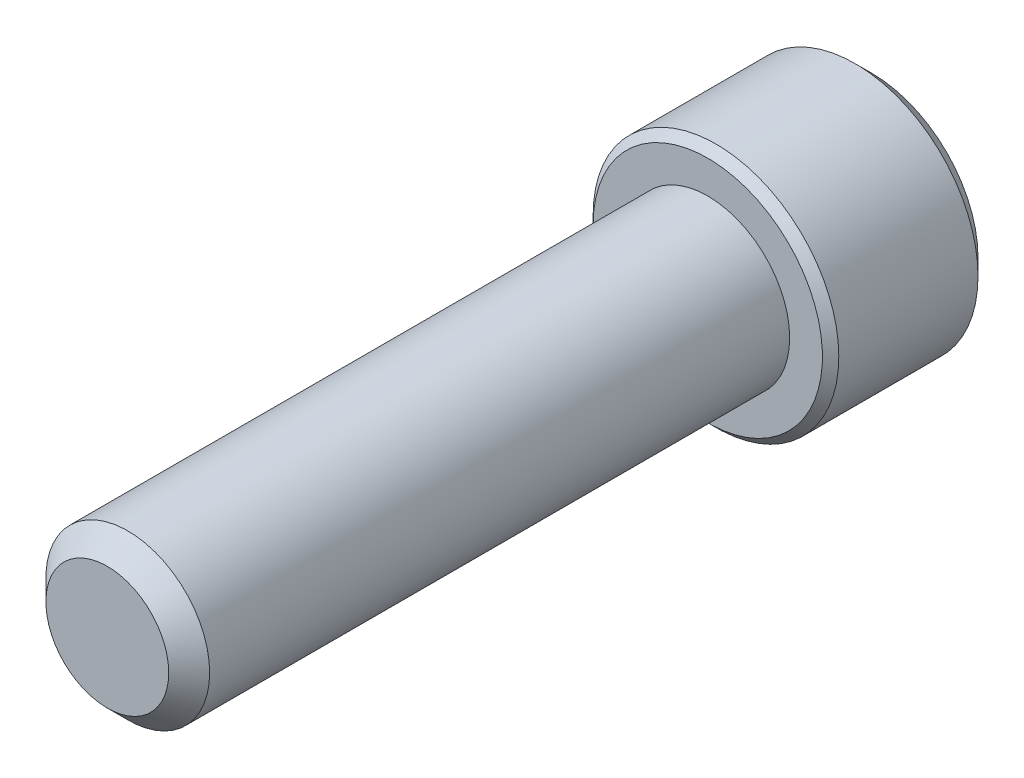
ISO-10303-21;
HEADER;
FILE_DESCRIPTION(('STEP AP214'),'2;1');
FILE_NAME('part.step','',(''),(''),'','','');
FILE_SCHEMA(('AUTOMOTIVE_DESIGN { 1 0 10303 214 1 1 1 1 }'));
ENDSEC;
DATA;
#1=APPLICATION_CONTEXT('core data for automotive mechanical design processes');
#2=APPLICATION_PROTOCOL_DEFINITION('international standard','automotive_design',2000,#1);
#3=PRODUCT_CONTEXT('',#1,'mechanical');
#4=PRODUCT('Part','Part','',(#3));
#5=PRODUCT_RELATED_PRODUCT_CATEGORY('part','',(#4));
#6=PRODUCT_DEFINITION_FORMATION('','',#4);
#7=PRODUCT_DEFINITION_CONTEXT('part definition',#1,'design');
#8=PRODUCT_DEFINITION('design','',#6,#7);
#9=PRODUCT_DEFINITION_SHAPE('','',#8);
#10=(LENGTH_UNIT() NAMED_UNIT(*) SI_UNIT(.MILLI.,.METRE.));
#11=(NAMED_UNIT(*) PLANE_ANGLE_UNIT() SI_UNIT($,.RADIAN.));
#12=(NAMED_UNIT(*) SI_UNIT($,.STERADIAN.) SOLID_ANGLE_UNIT());
#13=UNCERTAINTY_MEASURE_WITH_UNIT(LENGTH_MEASURE(1.E-05),#10,'distance_accuracy_value','');
#14=(GEOMETRIC_REPRESENTATION_CONTEXT(3) GLOBAL_UNCERTAINTY_ASSIGNED_CONTEXT((#13)) GLOBAL_UNIT_ASSIGNED_CONTEXT((#10,
#11,#12)) REPRESENTATION_CONTEXT('',''));
#15=CARTESIAN_POINT('',(0.,0.,0.));
#16=DIRECTION('',(0.,0.,1.));
#17=DIRECTION('',(1.,0.,0.));
#18=AXIS2_PLACEMENT_3D('',#15,#16,#17);
#19=CARTESIAN_POINT('',(0.,0.,-34.925));
#20=DIRECTION('',(0.,0.,1.));
#21=DIRECTION('',(1.,0.,0.));
#22=AXIS2_PLACEMENT_3D('',#19,#20,#21);
#23=CYLINDRICAL_SURFACE('',#22,4.7625);
#24=CARTESIAN_POINT('',(0.,0.,-1.190625));
#25=DIRECTION('',(0.,0.,1.));
#26=DIRECTION('',(1.,0.,0.));
#27=AXIS2_PLACEMENT_3D('',#24,#25,#26);
#28=CIRCLE('',#27,4.7625);
#29=CARTESIAN_POINT('',(4.7625,0.,-1.190625));
#30=VERTEX_POINT('',#29);
#31=EDGE_CURVE('E11',#30,#30,#28,.F.);
#32=ORIENTED_EDGE('',*,*,#31,.T.);
#33=EDGE_LOOP('',(#32));
#34=FACE_BOUND('',#33,.T.);
#35=CARTESIAN_POINT('',(0.,0.,-34.925));
#36=DIRECTION('',(0.,0.,-1.));
#37=DIRECTION('',(-1.,0.,0.));
#38=AXIS2_PLACEMENT_3D('',#35,#36,#37);
#39=CIRCLE('',#38,4.7625);
#40=CARTESIAN_POINT('',(-4.7625,0.,-34.925));
#41=VERTEX_POINT('',#40);
#42=EDGE_CURVE('E107',#41,#41,#39,.F.);
#43=ORIENTED_EDGE('',*,*,#42,.T.);
#44=EDGE_LOOP('',(#43));
#45=FACE_BOUND('',#44,.T.);
#46=ADVANCED_FACE('F33',(#34,#45),#23,.T.);
#47=CARTESIAN_POINT('',(0.,0.,0.));
#48=DIRECTION('',(0.,0.,1.));
#49=DIRECTION('',(1.,0.,0.));
#50=AXIS2_PLACEMENT_3D('',#47,#48,#49);
#51=PLANE('',#50);
#52=CARTESIAN_POINT('',(0.,0.,0.));
#53=DIRECTION('',(0.,0.,1.));
#54=DIRECTION('',(1.,0.,0.));
#55=AXIS2_PLACEMENT_3D('',#52,#53,#54);
#56=CIRCLE('',#55,3.571875);
#57=CARTESIAN_POINT('',(3.571875,0.,0.));
#58=VERTEX_POINT('',#57);
#59=EDGE_CURVE('E41',#58,#58,#56,.T.);
#60=ORIENTED_EDGE('',*,*,#59,.T.);
#61=EDGE_LOOP('',(#60));
#62=FACE_BOUND('',#61,.T.);
#63=ADVANCED_FACE('F177',(#62),#51,.T.);
#64=CARTESIAN_POINT('',(0.,0.,-44.45));
#65=DIRECTION('',(0.,0.,1.));
#66=DIRECTION('',(1.,0.,0.));
#67=AXIS2_PLACEMENT_3D('',#64,#65,#66);
#68=CYLINDRICAL_SURFACE('',#67,7.14375);
#69=CARTESIAN_POINT('',(0.,0.,-35.40125));
#70=DIRECTION('',(0.,0.,-1.));
#71=DIRECTION('',(-1.,0.,0.));
#72=AXIS2_PLACEMENT_3D('',#69,#70,#71);
#73=CIRCLE('',#72,7.14375);
#74=CARTESIAN_POINT('',(7.14375,0.,-35.40125));
#75=VERTEX_POINT('',#74);
#76=EDGE_CURVE('E169',#75,#75,#73,.T.);
#77=CARTESIAN_POINT('',(0.,0.,-43.4975));
#78=DIRECTION('',(0.,0.,-1.));
#79=DIRECTION('',(-1.,0.,0.));
#80=AXIS2_PLACEMENT_3D('',#77,#78,#79);
#81=CIRCLE('',#80,7.14375);
#82=CARTESIAN_POINT('',(7.14375,0.,-43.4975));
#83=VERTEX_POINT('',#82);
#84=EDGE_CURVE('E166',#83,#83,#81,.F.);
#85=CARTESIAN_POINT('',(7.14375,0.,-35.40125));
#86=CARTESIAN_POINT('',(7.14375,0.,-35.4855859375));
#87=CARTESIAN_POINT('',(7.14375,0.,-35.569921875));
#88=CARTESIAN_POINT('',(7.14375,0.,-35.73859375));
#89=CARTESIAN_POINT('',(7.14375,0.,-35.8229296875));
#90=CARTESIAN_POINT('',(7.14375,0.,-35.9916015625));
#91=CARTESIAN_POINT('',(7.14375,0.,-36.0759375));
#92=CARTESIAN_POINT('',(7.14375,0.,-36.244609375));
#93=CARTESIAN_POINT('',(7.14375,0.,-36.3289453125));
#94=CARTESIAN_POINT('',(7.14375,0.,-36.4976171875));
#95=CARTESIAN_POINT('',(7.14375,0.,-36.581953125));
#96=CARTESIAN_POINT('',(7.14375,0.,-36.750625));
#97=CARTESIAN_POINT('',(7.14375,0.,-36.8349609375));
#98=CARTESIAN_POINT('',(7.14375,0.,-37.0036328125));
#99=CARTESIAN_POINT('',(7.14375,0.,-37.08796875));
#100=CARTESIAN_POINT('',(7.14375,0.,-37.256640625));
#101=CARTESIAN_POINT('',(7.14375,0.,-37.3409765625));
#102=CARTESIAN_POINT('',(7.14375,0.,-37.5096484375));
#103=CARTESIAN_POINT('',(7.14375,0.,-37.593984375));
#104=CARTESIAN_POINT('',(7.14375,0.,-37.76265625));
#105=CARTESIAN_POINT('',(7.14375,0.,-37.8469921875));
#106=CARTESIAN_POINT('',(7.14375,0.,-38.0156640625));
#107=CARTESIAN_POINT('',(7.14375,0.,-38.1));
#108=CARTESIAN_POINT('',(7.14375,0.,-38.268671875));
#109=CARTESIAN_POINT('',(7.14375,0.,-38.3530078125));
#110=CARTESIAN_POINT('',(7.14375,0.,-38.5216796875));
#111=CARTESIAN_POINT('',(7.14375,0.,-38.606015625));
#112=CARTESIAN_POINT('',(7.14375,0.,-38.7746875));
#113=CARTESIAN_POINT('',(7.14375,0.,-38.8590234375));
#114=CARTESIAN_POINT('',(7.14375,0.,-39.0276953125));
#115=CARTESIAN_POINT('',(7.14375,0.,-39.11203125));
#116=CARTESIAN_POINT('',(7.14375,0.,-39.280703125));
#117=CARTESIAN_POINT('',(7.14375,0.,-39.3650390625));
#118=CARTESIAN_POINT('',(7.14375,0.,-39.5337109375));
#119=CARTESIAN_POINT('',(7.14375,0.,-39.618046875));
#120=CARTESIAN_POINT('',(7.14375,0.,-39.78671875));
#121=CARTESIAN_POINT('',(7.14375,0.,-39.8710546875));
#122=CARTESIAN_POINT('',(7.14375,0.,-40.0397265625));
#123=CARTESIAN_POINT('',(7.14375,0.,-40.1240625));
#124=CARTESIAN_POINT('',(7.14375,0.,-40.292734375));
#125=CARTESIAN_POINT('',(7.14375,0.,-40.3770703125));
#126=CARTESIAN_POINT('',(7.14375,0.,-40.5457421875));
#127=CARTESIAN_POINT('',(7.14375,0.,-40.630078125));
#128=CARTESIAN_POINT('',(7.14375,0.,-40.79875));
#129=CARTESIAN_POINT('',(7.14375,0.,-40.8830859375));
#130=CARTESIAN_POINT('',(7.14375,0.,-41.0517578125));
#131=CARTESIAN_POINT('',(7.14375,0.,-41.13609375));
#132=CARTESIAN_POINT('',(7.14375,0.,-41.304765625));
#133=CARTESIAN_POINT('',(7.14375,0.,-41.3891015625));
#134=CARTESIAN_POINT('',(7.14375,0.,-41.5577734375));
#135=CARTESIAN_POINT('',(7.14375,0.,-41.642109375));
#136=CARTESIAN_POINT('',(7.14375,0.,-41.81078125));
#137=CARTESIAN_POINT('',(7.14375,0.,-41.8951171875));
#138=CARTESIAN_POINT('',(7.14375,0.,-42.0637890625));
#139=CARTESIAN_POINT('',(7.14375,0.,-42.148125));
#140=CARTESIAN_POINT('',(7.14375,0.,-42.316796875));
#141=CARTESIAN_POINT('',(7.14375,0.,-42.4011328125));
#142=CARTESIAN_POINT('',(7.14375,0.,-42.5698046875));
#143=CARTESIAN_POINT('',(7.14375,0.,-42.654140625));
#144=CARTESIAN_POINT('',(7.14375,0.,-42.8228125));
#145=CARTESIAN_POINT('',(7.14375,0.,-42.9071484375));
#146=CARTESIAN_POINT('',(7.14375,0.,-43.0758203125));
#147=CARTESIAN_POINT('',(7.14375,0.,-43.16015625));
#148=CARTESIAN_POINT('',(7.14375,0.,-43.328828125));
#149=CARTESIAN_POINT('',(7.14375,0.,-43.4131640625));
#150=CARTESIAN_POINT('',(7.14375,0.,-43.4975));
#151=B_SPLINE_CURVE_WITH_KNOTS('',3,(#85,#86,#87,#88,#89,#90,#91,#92,#93,#94,#95,#96,#97,#98,
#99,#100,#101,#102,#103,#104,#105,#106,#107,#108,#109,#110,#111,#112,#113,#114,#115,#116,#117,
#118,#119,#120,#121,#122,#123,#124,#125,#126,#127,#128,#129,#130,#131,#132,#133,#134,#135,#136,
#137,#138,#139,#140,#141,#142,#143,#144,#145,#146,#147,#148,#149,#150),.UNSPECIFIED.,.F.,.F.,(4,
2,2,2,2,2,2,2,2,2,2,2,2,2,2,2,2,2,2,2,2,2,2,2,2,2,2,2,2,2,2,2,4),(0.,0.253007812499997,
0.506015625000002,0.759023437499999,1.01203125,1.26503906249999,1.518046875,1.7710546875,
2.0240625,2.2770703125,2.53007812499999,2.7830859375,3.03609375,3.2891015625,3.542109375,
3.7951171875,4.048125,4.3011328125,4.55414062499999,4.8071484375,5.06015625,5.31316406249999,
5.566171875,5.81917968749999,6.0721875,6.3251953125,6.57820312499999,6.8312109375,7.08421875,
7.33722656249999,7.590234375,7.8432421875,8.09625),.UNSPECIFIED.);
#152=EDGE_CURVE('BSEAM194',#75,#83,#151,.T.);
#153=ORIENTED_EDGE('',*,*,#76,.T.);
#154=ORIENTED_EDGE('',*,*,#84,.T.);
#155=ORIENTED_EDGE('',*,*,#152,.T.);
#156=ORIENTED_EDGE('',*,*,#152,.F.);
#157=EDGE_LOOP('',(#153,#155,#154,#156));
#158=FACE_BOUND('',#157,.T.);
#159=ADVANCED_FACE('F194',(#158),#68,.T.);
#160=CARTESIAN_POINT('',(0.,0.,-44.45));
#161=DIRECTION('',(0.,0.,-1.));
#162=DIRECTION('',(-1.,0.,0.));
#163=AXIS2_PLACEMENT_3D('',#160,#161,#162);
#164=PLANE('',#163);
#165=CARTESIAN_POINT('',(0.,0.,-44.45));
#166=DIRECTION('',(0.,0.,-1.));
#167=DIRECTION('',(-1.,0.,0.));
#168=AXIS2_PLACEMENT_3D('',#165,#166,#167);
#169=CIRCLE('',#168,6.19125000000003);
#170=CARTESIAN_POINT('',(6.19125000000003,0.,-44.45));
#171=VERTEX_POINT('',#170);
#172=EDGE_CURVE('E106',#171,#171,#169,.T.);
#173=ORIENTED_EDGE('',*,*,#172,.T.);
#174=EDGE_LOOP('',(#173));
#175=FACE_BOUND('',#174,.T.);
#176=CARTESIAN_POINT('',(0.,0.,-44.45));
#177=DIRECTION('',(0.,0.,-1.));
#178=DIRECTION('',(-1.,0.,0.));
#179=AXIS2_PLACEMENT_3D('',#176,#177,#178);
#180=CIRCLE('',#179,4.58271776169266);
#181=CARTESIAN_POINT('',(-3.96875,2.29135888084633,-44.45));
#182=VERTEX_POINT('',#181);
#183=CARTESIAN_POINT('',(0.,4.58271776169266,-44.45));
#184=VERTEX_POINT('',#183);
#185=EDGE_CURVE('E87',#182,#184,#180,.T.);
#186=ORIENTED_EDGE('',*,*,#185,.F.);
#187=CARTESIAN_POINT('',(-3.96875,-2.29135888084633,-44.45));
#188=VERTEX_POINT('',#187);
#189=EDGE_CURVE('E47',#188,#182,#180,.T.);
#190=ORIENTED_EDGE('',*,*,#189,.F.);
#191=CARTESIAN_POINT('',(0.,-4.58271776169266,-44.45));
#192=VERTEX_POINT('',#191);
#193=EDGE_CURVE('E401',#192,#188,#180,.T.);
#194=ORIENTED_EDGE('',*,*,#193,.F.);
#195=CARTESIAN_POINT('',(3.96875,-2.29135888084633,-44.45));
#196=VERTEX_POINT('',#195);
#197=EDGE_CURVE('E54',#196,#192,#180,.T.);
#198=ORIENTED_EDGE('',*,*,#197,.F.);
#199=CARTESIAN_POINT('',(3.96875,2.29135888084633,-44.45));
#200=VERTEX_POINT('',#199);
#201=EDGE_CURVE('E128',#200,#196,#180,.T.);
#202=ORIENTED_EDGE('',*,*,#201,.F.);
#203=EDGE_CURVE('E96',#184,#200,#180,.T.);
#204=ORIENTED_EDGE('',*,*,#203,.F.);
#205=EDGE_LOOP('',(#186,#190,#194,#198,#202,#204));
#206=FACE_BOUND('',#205,.T.);
#207=ADVANCED_FACE('F127',(#175,#206),#164,.T.);
#208=CARTESIAN_POINT('',(0.,0.,-34.925));
#209=DIRECTION('',(0.,0.,-1.));
#210=DIRECTION('',(-1.,0.,0.));
#211=AXIS2_PLACEMENT_3D('',#208,#209,#210);
#212=PLANE('',#211);
#213=CARTESIAN_POINT('',(0.,0.,-34.925));
#214=DIRECTION('',(0.,0.,-1.));
#215=DIRECTION('',(-1.,0.,0.));
#216=AXIS2_PLACEMENT_3D('',#213,#214,#215);
#217=CIRCLE('',#216,6.66749999999998);
#218=CARTESIAN_POINT('',(-6.66749999999998,0.,-34.925));
#219=VERTEX_POINT('',#218);
#220=EDGE_CURVE('E172',#219,#219,#217,.F.);
#221=ORIENTED_EDGE('',*,*,#220,.T.);
#222=EDGE_LOOP('',(#221));
#223=FACE_BOUND('',#222,.T.);
#224=ORIENTED_EDGE('',*,*,#42,.F.);
#225=EDGE_LOOP('',(#224));
#226=FACE_BOUND('',#225,.T.);
#227=ADVANCED_FACE('F210',(#223,#226),#212,.F.);
#228=CARTESIAN_POINT('',(0.,0.,-44.45));
#229=DIRECTION('',(0.,0.,-1.));
#230=DIRECTION('',(-1.,0.,0.));
#231=AXIS2_PLACEMENT_3D('',#228,#229,#230);
#232=CONICAL_SURFACE('',#231,4.58271776169266,0.78539816339745);
#233=ORIENTED_EDGE('',*,*,#203,.T.);
#234=CARTESIAN_POINT('',(-0.000200000000000929,4.58283323174649,-44.4501154744179));
#235=CARTESIAN_POINT('',(0.0680436803859708,4.54343272450516,-44.4107190135033));
#236=CARTESIAN_POINT('',(0.136809584821843,4.50373071106804,-44.3725312157826));
#237=CARTESIAN_POINT('',(0.275493415708868,4.42366156397317,-44.2989413714603));
#238=CARTESIAN_POINT('',(0.345411946528985,4.38329408138283,-44.2635408464105));
#239=CARTESIAN_POINT('',(0.557707505859669,4.2607251830555,-44.1617709068352));
#240=CARTESIAN_POINT('',(0.701888834466523,4.17748205417221,-44.1002673400195));
#241=CARTESIAN_POINT('',(0.992585660367388,4.00964816348578,-43.9949392939681));
#242=CARTESIAN_POINT('',(1.13902772950242,3.92509979544998,-43.9508495742591));
#243=CARTESIAN_POINT('',(1.43514553766434,3.75413609919586,-43.8829143133903));
#244=CARTESIAN_POINT('',(1.58481220774579,3.66772600693562,-43.8590180866405));
#245=CARTESIAN_POINT('',(1.84275672965522,3.51880166777522,-43.8374580589113));
#246=CARTESIAN_POINT('',(1.95070224659486,3.45647929451231,-43.8342672072687));
#247=CARTESIAN_POINT('',(2.16641807874268,3.33193570075329,-43.8396459790003));
#248=CARTESIAN_POINT('',(2.27418831927627,3.2697145233706,-43.8482197250599));
#249=CARTESIAN_POINT('',(2.4887076557444,3.14586172671434,-43.8766386528729));
#250=CARTESIAN_POINT('',(2.59545547357325,3.08423084535545,-43.8964964410767));
#251=CARTESIAN_POINT('',(2.80711777437236,2.96202755901179,-43.9463994540715));
#252=CARTESIAN_POINT('',(2.91203239726007,2.90145507324564,-43.9764438977693));
#253=CARTESIAN_POINT('',(3.0982812496352,2.7939242481906,-44.0382572973969));
#254=CARTESIAN_POINT('',(3.18002783101947,2.74672783742306,-44.0684010313299));
#255=CARTESIAN_POINT('',(3.34205349185908,2.65318227852169,-44.1335463964783));
#256=CARTESIAN_POINT('',(3.4223325265843,2.6068331562128,-44.1685481754861));
#257=CARTESIAN_POINT('',(3.58117016791194,2.51512820123484,-44.2426249778602));
#258=CARTESIAN_POINT('',(3.65973329214442,2.46976976031084,-44.2816871925354));
#259=CARTESIAN_POINT('',(3.81540464036892,2.37989286550831,-44.3633719201149));
#260=CARTESIAN_POINT('',(3.89251372186607,2.33537391654897,-44.405992248695));
#261=CARTESIAN_POINT('',(3.96895,2.29124341079249,-44.4501154744179));
#262=B_SPLINE_CURVE_WITH_KNOTS('',3,(#234,#235,#236,#237,#238,#239,#240,#241,#242,#243,#244,
#245,#246,#247,#248,#249,#250,#251,#252,#253,#254,#255,#256,#257,#258,#259,#260,#261),
.UNSPECIFIED.,.F.,.F.,(4,2,2,2,2,2,2,2,2,2,2,2,2,4),(0.,0.264281222504265,0.528705728104598,
1.06040984450884,1.58367029033775,2.10561342008457,2.47914251806346,2.8528025458361,
3.22688084694382,3.60093047093423,3.89805841615096,4.19519540263381,4.49142198422536,
4.787468031214),.UNSPECIFIED.);
#263=EDGE_CURVE('E101',#184,#200,#262,.T.);
#264=ORIENTED_EDGE('',*,*,#263,.F.);
#265=EDGE_LOOP('',(#233,#264));
#266=FACE_BOUND('',#265,.T.);
#267=ADVANCED_FACE('F102',(#266),#232,.F.);
#268=ORIENTED_EDGE('',*,*,#201,.T.);
#269=CARTESIAN_POINT('',(3.96875,-4.64630735365938,-45.9778590185441));
#270=CARTESIAN_POINT('',(3.96875,-4.5335126537248,-45.8921125830598));
#271=CARTESIAN_POINT('',(3.96875,-4.42009504617574,-45.8071723819266));
#272=CARTESIAN_POINT('',(3.96875,-4.19176503547267,-45.6392681302667));
#273=CARTESIAN_POINT('',(3.96875,-4.07685227192049,-45.5563045703711));
#274=CARTESIAN_POINT('',(3.96875,-3.84444231174023,-45.3921269435066));
#275=CARTESIAN_POINT('',(3.96875,-3.72693199641973,-45.3109313852313));
#276=CARTESIAN_POINT('',(3.96875,-3.48993038179064,-45.1514944269305));
#277=CARTESIAN_POINT('',(3.96875,-3.37043922189928,-45.0732528202576));
#278=CARTESIAN_POINT('',(3.96875,-3.12198803395597,-44.9158465831364));
#279=CARTESIAN_POINT('',(3.96875,-2.99288714694552,-44.8369031612569));
#280=CARTESIAN_POINT('',(3.96875,-2.73166419664421,-44.6841006235844));
#281=CARTESIAN_POINT('',(3.96875,-2.59954164843319,-44.6102423315961));
#282=CARTESIAN_POINT('',(3.96875,-2.33227001787838,-44.4691962721011));
#283=CARTESIAN_POINT('',(3.96875,-2.19713136543482,-44.4019888954289));
#284=CARTESIAN_POINT('',(3.96875,-1.92311840845954,-44.2757497626779));
#285=CARTESIAN_POINT('',(3.96875,-1.78424585690933,-44.2167142474524));
#286=CARTESIAN_POINT('',(3.96875,-1.51481816618405,-44.1136397996533));
#287=CARTESIAN_POINT('',(3.96875,-1.38459515710119,-44.0687416357088));
#288=CARTESIAN_POINT('',(3.96875,-1.12094711822385,-43.9893826762423));
#289=CARTESIAN_POINT('',(3.96875,-0.987521874883001,-43.9549225788991));
#290=CARTESIAN_POINT('',(3.96875,-0.72052256418104,-43.8988361610041));
#291=CARTESIAN_POINT('',(3.96875,-0.586996472003362,-43.8769852186589));
#292=CARTESIAN_POINT('',(3.96875,-0.318432438146856,-43.8465533944044));
#293=CARTESIAN_POINT('',(3.96875,-0.18339477957253,-43.8379700681153));
#294=CARTESIAN_POINT('',(3.96875,0.0816031894401696,-43.8347453767878));
#295=CARTESIAN_POINT('',(3.96875,0.211557224436373,-43.8395760210813));
#296=CARTESIAN_POINT('',(3.96875,0.470389069878835,-43.8617291313832));
#297=CARTESIAN_POINT('',(3.96875,0.599266776914037,-43.8790527840358));
#298=CARTESIAN_POINT('',(3.96875,0.857193625874951,-43.9255288939014));
#299=CARTESIAN_POINT('',(3.96875,0.986205403294222,-43.954885351875));
#300=CARTESIAN_POINT('',(3.96875,1.24140790449419,-44.0238387114415));
#301=CARTESIAN_POINT('',(3.96875,1.36759883671833,-44.0634348536477));
#302=CARTESIAN_POINT('',(3.96875,1.62688284335293,-44.1546865639009));
#303=CARTESIAN_POINT('',(3.96875,1.75972335208346,-44.2070522235694));
#304=CARTESIAN_POINT('',(3.96875,2.02196761970177,-44.319843732606));
#305=CARTESIAN_POINT('',(3.96875,2.15136976451499,-44.3802732899727));
#306=CARTESIAN_POINT('',(3.96875,2.4073611922025,-44.5077568722523));
#307=CARTESIAN_POINT('',(3.96875,2.53394010797952,-44.5748315466293));
#308=CARTESIAN_POINT('',(3.96875,2.78419006199756,-44.7141253624497));
#309=CARTESIAN_POINT('',(3.96875,2.90786155285838,-44.7863436959938));
#310=CARTESIAN_POINT('',(3.96875,3.14660973207927,-44.9312316042042));
#311=CARTESIAN_POINT('',(3.96875,3.2618084697785,-45.0037011261472));
#312=CARTESIAN_POINT('',(3.96875,3.49022758250214,-45.1517029087798));
#313=CARTESIAN_POINT('',(3.96875,3.6034478073154,-45.2272354005808));
#314=CARTESIAN_POINT('',(3.96875,3.82725368719914,-45.3801957961807));
#315=CARTESIAN_POINT('',(3.96875,3.93785324297254,-45.4576034339638));
#316=CARTESIAN_POINT('',(3.96875,4.15753846454747,-45.6144772214055));
#317=CARTESIAN_POINT('',(3.96875,4.26662453876053,-45.69394279846));
#318=CARTESIAN_POINT('',(3.96875,4.37507639149037,-45.7742501571195));
#319=B_SPLINE_CURVE_WITH_KNOTS('',3,(#269,#270,#271,#272,#273,#274,#275,#276,#277,#278,#279,
#280,#281,#282,#283,#284,#285,#286,#287,#288,#289,#290,#291,#292,#293,#294,#295,#296,#297,#298,
#299,#300,#301,#302,#303,#304,#305,#306,#307,#308,#309,#310,#311,#312,#313,#314,#315,#316,#317,
#318),.UNSPECIFIED.,.F.,.F.,(4,2,2,2,2,2,2,2,2,2,2,2,2,2,2,2,2,2,2,2,2,2,2,2,4),(0.,
0.425068015157816,0.850240461771206,1.27870338864506,1.70713628610205,2.16101664558923,
2.61497036272768,3.0675430871778,3.51990692634532,3.93278359971785,4.34568788339236,
4.75098947605416,5.15621638844989,5.5457215877271,5.93526378889747,6.33170291010567,
6.7281126393643,7.15614890830235,7.58438268252869,8.01399160872287,8.44353320568575,
8.85176939796131,9.2600364505441,9.66500210596465,10.0698562687698),.UNSPECIFIED.);
#320=EDGE_CURVE('E95',#200,#196,#319,.F.);
#321=ORIENTED_EDGE('',*,*,#320,.F.);
#322=EDGE_LOOP('',(#268,#321));
#323=FACE_BOUND('',#322,.T.);
#324=ADVANCED_FACE('F276',(#323),#232,.F.);
#325=ORIENTED_EDGE('',*,*,#197,.T.);
#326=CARTESIAN_POINT('',(3.96895,-2.29124341079249,-44.4501154744179));
#327=CARTESIAN_POINT('',(3.90070631961403,-2.33064391803382,-44.4107190135033));
#328=CARTESIAN_POINT('',(3.83194041517815,-2.37034593147094,-44.3725312157826));
#329=CARTESIAN_POINT('',(3.69325658429113,-2.45041507856581,-44.2989413714603));
#330=CARTESIAN_POINT('',(3.62333805347101,-2.49078256115615,-44.2635408464105));
#331=CARTESIAN_POINT('',(3.41104249414033,-2.61335145948349,-44.1617709068352));
#332=CARTESIAN_POINT('',(3.26686116553347,-2.69659458836677,-44.1002673400195));
#333=CARTESIAN_POINT('',(2.97616433963261,-2.8644284790532,-43.9949392939681));
#334=CARTESIAN_POINT('',(2.82972227049757,-2.948976847089,-43.9508495742591));
#335=CARTESIAN_POINT('',(2.53360446233565,-3.11994054334313,-43.8829143133903));
#336=CARTESIAN_POINT('',(2.38393779225421,-3.20635063560337,-43.8590180866405));
#337=CARTESIAN_POINT('',(2.12599327034477,-3.35527497476377,-43.8374580589113));
#338=CARTESIAN_POINT('',(2.01804775340514,-3.41759734802668,-43.8342672072687));
#339=CARTESIAN_POINT('',(1.80233192125731,-3.54214094178569,-43.8396459790003));
#340=CARTESIAN_POINT('',(1.69456168072373,-3.60436211916838,-43.8482197250599));
#341=CARTESIAN_POINT('',(1.4800423442556,-3.72821491582464,-43.8766386528729));
#342=CARTESIAN_POINT('',(1.37329452642675,-3.78984579718353,-43.8964964410767));
#343=CARTESIAN_POINT('',(1.16163222562764,-3.91204908352719,-43.9463994540715));
#344=CARTESIAN_POINT('',(1.05671760273993,-3.97262156929334,-43.9764438977693));
#345=CARTESIAN_POINT('',(0.870468750364795,-4.08015239434838,-44.0382572973969));
#346=CARTESIAN_POINT('',(0.788722168980521,-4.12734880511592,-44.0684010313299));
#347=CARTESIAN_POINT('',(0.626696508140919,-4.2208943640173,-44.1335463964783));
#348=CARTESIAN_POINT('',(0.546417473415699,-4.26724348632619,-44.1685481754861));
#349=CARTESIAN_POINT('',(0.387579832088063,-4.35894844130414,-44.2426249778602));
#350=CARTESIAN_POINT('',(0.309016707855574,-4.40430688222815,-44.2816871925354));
#351=CARTESIAN_POINT('',(0.15334535963108,-4.49418377703067,-44.3633719201149));
#352=CARTESIAN_POINT('',(0.0762362781339232,-4.53870272599002,-44.405992248695));
#353=CARTESIAN_POINT('',(-0.000200000000000428,-4.58283323174649,-44.4501154744179));
#354=B_SPLINE_CURVE_WITH_KNOTS('',3,(#326,#327,#328,#329,#330,#331,#332,#333,#334,#335,#336,
#337,#338,#339,#340,#341,#342,#343,#344,#345,#346,#347,#348,#349,#350,#351,#352,#353),
.UNSPECIFIED.,.F.,.F.,(4,2,2,2,2,2,2,2,2,2,2,2,2,4),(0.,0.264281222504267,0.528705728104602,
1.06040984450885,1.58367029033775,2.10561342008457,2.47914251806346,2.8528025458361,
3.22688084694382,3.60093047093424,3.89805841615097,4.19519540263382,4.49142198422536,
4.787468031214),.UNSPECIFIED.);
#355=EDGE_CURVE('E137',#196,#192,#354,.T.);
#356=ORIENTED_EDGE('',*,*,#355,.F.);
#357=EDGE_LOOP('',(#325,#356));
#358=FACE_BOUND('',#357,.T.);
#359=ADVANCED_FACE('F268',(#358),#232,.F.);
#360=ORIENTED_EDGE('',*,*,#193,.T.);
#361=CARTESIAN_POINT('',(0.000200000000001477,-4.58283323174649,-44.4501154744179));
#362=CARTESIAN_POINT('',(-0.0680436803859708,-4.54343272450516,-44.4107190135033));
#363=CARTESIAN_POINT('',(-0.136809584821844,-4.50373071106804,-44.3725312157826));
#364=CARTESIAN_POINT('',(-0.275493415708871,-4.42366156397317,-44.2989413714603));
#365=CARTESIAN_POINT('',(-0.345411946528988,-4.38329408138283,-44.2635408464105));
#366=CARTESIAN_POINT('',(-0.557707505859671,-4.2607251830555,-44.1617709068352));
#367=CARTESIAN_POINT('',(-0.701888834466525,-4.17748205417221,-44.1002673400195));
#368=CARTESIAN_POINT('',(-0.992585660367389,-4.00964816348578,-43.9949392939681));
#369=CARTESIAN_POINT('',(-1.13902772950243,-3.92509979544998,-43.9508495742591));
#370=CARTESIAN_POINT('',(-1.43514553766435,-3.75413609919585,-43.8829143133903));
#371=CARTESIAN_POINT('',(-1.58481220774579,-3.66772600693562,-43.8590180866405));
#372=CARTESIAN_POINT('',(-1.84275672965523,-3.51880166777521,-43.8374580589113));
#373=CARTESIAN_POINT('',(-1.95070224659486,-3.4564792945123,-43.8342672072687));
#374=CARTESIAN_POINT('',(-2.16641807874268,-3.33193570075329,-43.8396459790003));
#375=CARTESIAN_POINT('',(-2.27418831927627,-3.2697145233706,-43.8482197250599));
#376=CARTESIAN_POINT('',(-2.4887076557444,-3.14586172671434,-43.8766386528729));
#377=CARTESIAN_POINT('',(-2.59545547357325,-3.08423084535545,-43.8964964410767));
#378=CARTESIAN_POINT('',(-2.80711777437236,-2.96202755901179,-43.9463994540715));
#379=CARTESIAN_POINT('',(-2.91203239726007,-2.90145507324564,-43.9764438977693));
#380=CARTESIAN_POINT('',(-3.0982812496352,-2.7939242481906,-44.0382572973969));
#381=CARTESIAN_POINT('',(-3.18002783101947,-2.74672783742306,-44.0684010313299));
#382=CARTESIAN_POINT('',(-3.34205349185908,-2.65318227852169,-44.1335463964783));
#383=CARTESIAN_POINT('',(-3.4223325265843,-2.6068331562128,-44.1685481754861));
#384=CARTESIAN_POINT('',(-3.58117016791194,-2.51512820123484,-44.2426249778602));
#385=CARTESIAN_POINT('',(-3.65973329214443,-2.46976976031083,-44.2816871925354));
#386=CARTESIAN_POINT('',(-3.81540464036892,-2.37989286550831,-44.3633719201149));
#387=CARTESIAN_POINT('',(-3.89251372186608,-2.33537391654896,-44.405992248695));
#388=CARTESIAN_POINT('',(-3.96895,-2.29124341079249,-44.4501154744179));
#389=B_SPLINE_CURVE_WITH_KNOTS('',3,(#361,#362,#363,#364,#365,#366,#367,#368,#369,#370,#371,
#372,#373,#374,#375,#376,#377,#378,#379,#380,#381,#382,#383,#384,#385,#386,#387,#388),
.UNSPECIFIED.,.F.,.F.,(4,2,2,2,2,2,2,2,2,2,2,2,2,4),(0.,0.264281222504267,0.528705728104602,
1.06040984450885,1.58367029033775,2.10561342008457,2.47914251806346,2.8528025458361,
3.22688084694382,3.60093047093424,3.89805841615096,4.19519540263381,4.49142198422537,
4.787468031214),.UNSPECIFIED.);
#390=EDGE_CURVE('E364',#192,#188,#389,.T.);
#391=ORIENTED_EDGE('',*,*,#390,.F.);
#392=EDGE_LOOP('',(#360,#391));
#393=FACE_BOUND('',#392,.T.);
#394=ADVANCED_FACE('F261',(#393),#232,.F.);
#395=ORIENTED_EDGE('',*,*,#189,.T.);
#396=CARTESIAN_POINT('',(-3.96875,-4.64630735382297,-45.9778590186685));
#397=CARTESIAN_POINT('',(-3.96875,-4.53351265388375,-45.8921125831794));
#398=CARTESIAN_POINT('',(-3.96875,-4.42009504633003,-45.8071723820414));
#399=CARTESIAN_POINT('',(-3.96875,-4.19176503561762,-45.6392681303719));
#400=CARTESIAN_POINT('',(-3.96875,-4.07685227206074,-45.5563045704716));
#401=CARTESIAN_POINT('',(-3.96875,-3.84444231187092,-45.3921269435975));
#402=CARTESIAN_POINT('',(-3.96875,-3.72693199654556,-45.3109313853174));
#403=CARTESIAN_POINT('',(-3.96875,-3.48993038190667,-45.1514944270071));
#404=CARTESIAN_POINT('',(-3.96875,-3.37043922201036,-45.0732528203295));
#405=CARTESIAN_POINT('',(-3.96875,-3.12198803405638,-44.9158465831985));
#406=CARTESIAN_POINT('',(-3.96875,-2.9928871470402,-44.8369031613138));
#407=CARTESIAN_POINT('',(-3.96875,-2.73166419672721,-44.6841006236314));
#408=CARTESIAN_POINT('',(-3.96875,-2.59954164851024,-44.6102423316382));
#409=CARTESIAN_POINT('',(-3.96875,-2.33227001794333,-44.4691962721339));
#410=CARTESIAN_POINT('',(-3.96875,-2.19713136549362,-44.4019888954572));
#411=CARTESIAN_POINT('',(-3.96875,-1.9231184085057,-44.2757497626979));
#412=CARTESIAN_POINT('',(-3.96875,-1.78424585694901,-44.2167142474685));
#413=CARTESIAN_POINT('',(-3.96875,-1.51481816622096,-44.1136397996665));
#414=CARTESIAN_POINT('',(-3.96875,-1.3845951571421,-44.0687416357224));
#415=CARTESIAN_POINT('',(-3.96875,-1.12094711827292,-43.9893826762558));
#416=CARTESIAN_POINT('',(-3.96875,-0.987521874936209,-43.9549225789121));
#417=CARTESIAN_POINT('',(-3.96875,-0.720522564242405,-43.8988361610152));
#418=CARTESIAN_POINT('',(-3.96875,-0.586996472068737,-43.8769852186687));
#419=CARTESIAN_POINT('',(-3.96875,-0.318432438220127,-43.8465533944104));
#420=CARTESIAN_POINT('',(-3.96875,-0.183394779649687,-43.837970068119));
#421=CARTESIAN_POINT('',(-3.96875,0.0816031893560513,-43.8347453767862));
#422=CARTESIAN_POINT('',(-3.96875,0.211557224349169,-43.8395760210767));
#423=CARTESIAN_POINT('',(-3.96875,0.470389069785781,-43.8617291313723));
#424=CARTESIAN_POINT('',(-3.96875,0.599266776818218,-43.8790527840216));
#425=CARTESIAN_POINT('',(-3.96875,0.857193625773675,-43.92552889388));
#426=CARTESIAN_POINT('',(-3.96875,0.986205403190261,-43.9548853518499));
#427=CARTESIAN_POINT('',(-3.96875,1.24140790438513,-44.0238387114089));
#428=CARTESIAN_POINT('',(-3.96875,1.36759883660685,-44.0634348536114));
#429=CARTESIAN_POINT('',(-3.96875,1.62688284322827,-44.1546865638538));
#430=CARTESIAN_POINT('',(-3.96875,1.75972335194825,-44.2070522235147));
#431=CARTESIAN_POINT('',(-3.96875,2.02196761954602,-44.3198437325355));
#432=CARTESIAN_POINT('',(-3.96875,2.15136976434924,-44.3802732898939));
#433=CARTESIAN_POINT('',(-3.96875,2.40736119201712,-44.5077568721563));
#434=CARTESIAN_POINT('',(-3.96875,2.53394010778449,-44.5748315465244));
#435=CARTESIAN_POINT('',(-3.96875,2.78419006178357,-44.7141253623269));
#436=CARTESIAN_POINT('',(-3.96875,2.90786155263507,-44.7863436958619));
#437=CARTESIAN_POINT('',(-3.96875,3.14660973183902,-44.931231604055));
#438=CARTESIAN_POINT('',(-3.96875,3.2618084695306,-45.0037011259898));
#439=CARTESIAN_POINT('',(-3.96875,3.49022758223905,-45.1517029086061));
#440=CARTESIAN_POINT('',(-3.96875,3.60344780704478,-45.2272354003989));
#441=CARTESIAN_POINT('',(-3.96875,3.82725368691363,-45.3801957959825));
#442=CARTESIAN_POINT('',(-3.96875,3.93785324267968,-45.4576034337576));
#443=CARTESIAN_POINT('',(-3.96875,4.15753846423994,-45.614477221183));
#444=CARTESIAN_POINT('',(-3.96875,4.2666245384457,-45.6939427982295));
#445=CARTESIAN_POINT('',(-3.96875,4.37507639116824,-45.7742501568809));
#446=B_SPLINE_CURVE_WITH_KNOTS('',3,(#396,#397,#398,#399,#400,#401,#402,#403,#404,#405,#406,
#407,#408,#409,#410,#411,#412,#413,#414,#415,#416,#417,#418,#419,#420,#421,#422,#423,#424,#425,
#426,#427,#428,#429,#430,#431,#432,#433,#434,#435,#436,#437,#438,#439,#440,#441,#442,#443,#444,
#445),.UNSPECIFIED.,.F.,.F.,(4,2,2,2,2,2,2,2,2,2,2,2,2,2,2,2,2,2,2,2,2,2,2,2,4),(0.,
0.425068015177617,0.850240461810806,1.27870338870483,1.707136286182,2.16101664569182,
2.61497036285294,3.06754308732553,3.51990692651549,3.93278359987638,4.34568788353926,
4.75098947618993,5.15621638857454,5.54572158784222,5.93526378900303,6.33170291020091,
6.72811263944922,7.15614890834958,7.58438268253818,8.01399160869441,8.44353320561934,
8.85176939786246,9.26003645041282,9.66500210580137,10.0698562685745),.UNSPECIFIED.);
#447=EDGE_CURVE('E117',#188,#182,#446,.T.);
#448=ORIENTED_EDGE('',*,*,#447,.F.);
#449=EDGE_LOOP('',(#395,#448));
#450=FACE_BOUND('',#449,.T.);
#451=ADVANCED_FACE('F253',(#450),#232,.F.);
#452=ORIENTED_EDGE('',*,*,#185,.T.);
#453=CARTESIAN_POINT('',(-3.96895,2.29124341079249,-44.4501154744179));
#454=CARTESIAN_POINT('',(-3.90070631961403,2.33064391803382,-44.4107190135033));
#455=CARTESIAN_POINT('',(-3.83194041517815,2.37034593147094,-44.3725312157826));
#456=CARTESIAN_POINT('',(-3.69325658429113,2.45041507856582,-44.2989413714603));
#457=CARTESIAN_POINT('',(-3.62333805347101,2.49078256115615,-44.2635408464105));
#458=CARTESIAN_POINT('',(-3.41104249414032,2.61335145948349,-44.1617709068352));
#459=CARTESIAN_POINT('',(-3.26686116553347,2.69659458836677,-44.1002673400195));
#460=CARTESIAN_POINT('',(-2.97616433963261,2.86442847905321,-43.9949392939681));
#461=CARTESIAN_POINT('',(-2.82972227049757,2.948976847089,-43.9508495742591));
#462=CARTESIAN_POINT('',(-2.53360446233565,3.11994054334313,-43.8829143133903));
#463=CARTESIAN_POINT('',(-2.38393779225421,3.20635063560337,-43.8590180866405));
#464=CARTESIAN_POINT('',(-2.12599327034477,3.35527497476377,-43.8374580589113));
#465=CARTESIAN_POINT('',(-2.01804775340514,3.41759734802668,-43.8342672072687));
#466=CARTESIAN_POINT('',(-1.80233192125732,3.54214094178569,-43.8396459790003));
#467=CARTESIAN_POINT('',(-1.69456168072374,3.60436211916838,-43.8482197250599));
#468=CARTESIAN_POINT('',(-1.4800423442556,3.72821491582464,-43.8766386528729));
#469=CARTESIAN_POINT('',(-1.37329452642675,3.78984579718353,-43.8964964410767));
#470=CARTESIAN_POINT('',(-1.16163222562764,3.91204908352719,-43.9463994540715));
#471=CARTESIAN_POINT('',(-1.05671760273993,3.97262156929334,-43.9764438977693));
#472=CARTESIAN_POINT('',(-0.870468750364799,4.08015239434838,-44.0382572973969));
#473=CARTESIAN_POINT('',(-0.788722168980524,4.12734880511592,-44.0684010313299));
#474=CARTESIAN_POINT('',(-0.626696508140921,4.2208943640173,-44.1335463964783));
#475=CARTESIAN_POINT('',(-0.546417473415701,4.26724348632619,-44.1685481754861));
#476=CARTESIAN_POINT('',(-0.387579832088065,4.35894844130414,-44.2426249778602));
#477=CARTESIAN_POINT('',(-0.309016707855575,4.40430688222815,-44.2816871925354));
#478=CARTESIAN_POINT('',(-0.15334535963108,4.49418377703067,-44.3633719201149));
#479=CARTESIAN_POINT('',(-0.0762362781339238,4.53870272599002,-44.405992248695));
#480=CARTESIAN_POINT('',(0.000200000000000161,4.58283323174649,-44.4501154744179));
#481=B_SPLINE_CURVE_WITH_KNOTS('',3,(#453,#454,#455,#456,#457,#458,#459,#460,#461,#462,#463,
#464,#465,#466,#467,#468,#469,#470,#471,#472,#473,#474,#475,#476,#477,#478,#479,#480),
.UNSPECIFIED.,.F.,.F.,(4,2,2,2,2,2,2,2,2,2,2,2,2,4),(0.,0.264281222504268,0.528705728104604,
1.06040984450885,1.58367029033775,2.10561342008457,2.47914251806346,2.8528025458361,
3.22688084694382,3.60093047093423,3.89805841615097,4.19519540263381,4.49142198422536,
4.78746803121399),.UNSPECIFIED.);
#482=EDGE_CURVE('E91',#182,#184,#481,.T.);
#483=ORIENTED_EDGE('',*,*,#482,.F.);
#484=EDGE_LOOP('',(#452,#483));
#485=FACE_BOUND('',#484,.T.);
#486=ADVANCED_FACE('F89',(#485),#232,.F.);
#487=CARTESIAN_POINT('',(0.,4.58271776169266,-38.496875));
#488=DIRECTION('',(0.,0.,-1.));
#489=DIRECTION('',(-1.,0.,0.));
#490=AXIS2_PLACEMENT_3D('',#487,#488,#489);
#491=PLANE('',#490);
#492=DIRECTION('',(0.866025403784439,0.5,0.));
#493=VECTOR('',#492,1.);
#494=CARTESIAN_POINT('',(-3.96875,2.29135888084633,-38.496875));
#495=LINE('',#494,#493);
#496=CARTESIAN_POINT('',(-3.96875,2.29135888084633,-38.496875));
#497=VERTEX_POINT('',#496);
#498=CARTESIAN_POINT('',(0.,4.58271776169266,-38.496875));
#499=VERTEX_POINT('',#498);
#500=EDGE_CURVE('E116',#497,#499,#495,.T.);
#501=ORIENTED_EDGE('',*,*,#500,.T.);
#502=DIRECTION('',(0.866025403784439,-0.5,0.));
#503=VECTOR('',#502,1.);
#504=CARTESIAN_POINT('',(0.,4.58271776169266,-38.496875));
#505=LINE('',#504,#503);
#506=CARTESIAN_POINT('',(3.96875,2.29135888084633,-38.496875));
#507=VERTEX_POINT('',#506);
#508=EDGE_CURVE('E121',#499,#507,#505,.T.);
#509=ORIENTED_EDGE('',*,*,#508,.T.);
#510=DIRECTION('',(0.,-1.,0.));
#511=VECTOR('',#510,1.);
#512=CARTESIAN_POINT('',(3.96875,2.29135888084633,-38.496875));
#513=LINE('',#512,#511);
#514=CARTESIAN_POINT('',(3.96875,-2.29135888084633,-38.496875));
#515=VERTEX_POINT('',#514);
#516=EDGE_CURVE('E374',#507,#515,#513,.T.);
#517=ORIENTED_EDGE('',*,*,#516,.T.);
#518=DIRECTION('',(-0.866025403784439,-0.5,0.));
#519=VECTOR('',#518,1.);
#520=CARTESIAN_POINT('',(3.96875,-2.29135888084633,-38.496875));
#521=LINE('',#520,#519);
#522=CARTESIAN_POINT('',(0.,-4.58271776169265,-38.496875));
#523=VERTEX_POINT('',#522);
#524=EDGE_CURVE('E377',#515,#523,#521,.T.);
#525=ORIENTED_EDGE('',*,*,#524,.T.);
#526=DIRECTION('',(-0.866025403784439,0.5,0.));
#527=VECTOR('',#526,1.);
#528=CARTESIAN_POINT('',(0.,-4.58271776169265,-38.496875));
#529=LINE('',#528,#527);
#530=CARTESIAN_POINT('',(-3.96875,-2.29135888084633,-38.496875));
#531=VERTEX_POINT('',#530);
#532=EDGE_CURVE('E380',#523,#531,#529,.T.);
#533=ORIENTED_EDGE('',*,*,#532,.T.);
#534=DIRECTION('',(0.,1.,0.));
#535=VECTOR('',#534,1.);
#536=CARTESIAN_POINT('',(-3.96875,-2.29135888084633,-38.496875));
#537=LINE('',#536,#535);
#538=EDGE_CURVE('E124',#531,#497,#537,.T.);
#539=ORIENTED_EDGE('',*,*,#538,.T.);
#540=EDGE_LOOP('',(#501,#509,#517,#525,#533,#539));
#541=FACE_BOUND('',#540,.T.);
#542=ADVANCED_FACE('F156',(#541),#491,.T.);
#543=CARTESIAN_POINT('',(0.,4.58271776169266,-38.496875));
#544=DIRECTION('',(0.5,0.866025403784439,0.));
#545=DIRECTION('',(-0.866025403784439,0.5,0.));
#546=AXIS2_PLACEMENT_3D('',#543,#544,#545);
#547=PLANE('',#546);
#548=DIRECTION('',(0.,0.,-1.));
#549=VECTOR('',#548,1.);
#550=CARTESIAN_POINT('',(0.,4.58271776169266,-38.496875));
#551=LINE('',#550,#549);
#552=EDGE_CURVE('E113',#499,#184,#551,.T.);
#553=ORIENTED_EDGE('',*,*,#552,.T.);
#554=ORIENTED_EDGE('',*,*,#263,.T.);
#555=DIRECTION('',(0.,0.,-1.));
#556=VECTOR('',#555,1.);
#557=CARTESIAN_POINT('',(3.96875,2.29135888084633,-38.496875));
#558=LINE('',#557,#556);
#559=EDGE_CURVE('E123',#507,#200,#558,.T.);
#560=ORIENTED_EDGE('',*,*,#559,.F.);
#561=ORIENTED_EDGE('',*,*,#508,.F.);
#562=EDGE_LOOP('',(#553,#554,#560,#561));
#563=FACE_BOUND('',#562,.T.);
#564=ADVANCED_FACE('F119',(#563),#547,.F.);
#565=CARTESIAN_POINT('',(3.96875,2.29135888084633,-38.496875));
#566=DIRECTION('',(1.,0.,0.));
#567=DIRECTION('',(0.,0.,-1.));
#568=AXIS2_PLACEMENT_3D('',#565,#566,#567);
#569=PLANE('',#568);
#570=ORIENTED_EDGE('',*,*,#559,.T.);
#571=ORIENTED_EDGE('',*,*,#320,.T.);
#572=DIRECTION('',(0.,0.,-1.));
#573=VECTOR('',#572,1.);
#574=CARTESIAN_POINT('',(3.96875,-2.29135888084633,-38.496875));
#575=LINE('',#574,#573);
#576=EDGE_CURVE('E391',#515,#196,#575,.T.);
#577=ORIENTED_EDGE('',*,*,#576,.F.);
#578=ORIENTED_EDGE('',*,*,#516,.F.);
#579=EDGE_LOOP('',(#570,#571,#577,#578));
#580=FACE_BOUND('',#579,.T.);
#581=ADVANCED_FACE('F145',(#580),#569,.F.);
#582=CARTESIAN_POINT('',(3.96875,-2.29135888084633,-38.496875));
#583=DIRECTION('',(0.5,-0.866025403784439,0.));
#584=DIRECTION('',(0.866025403784439,0.5,0.));
#585=AXIS2_PLACEMENT_3D('',#582,#583,#584);
#586=PLANE('',#585);
#587=ORIENTED_EDGE('',*,*,#576,.T.);
#588=ORIENTED_EDGE('',*,*,#355,.T.);
#589=DIRECTION('',(0.,0.,-1.));
#590=VECTOR('',#589,1.);
#591=CARTESIAN_POINT('',(0.,-4.58271776169265,-38.496875));
#592=LINE('',#591,#590);
#593=EDGE_CURVE('E388',#523,#192,#592,.T.);
#594=ORIENTED_EDGE('',*,*,#593,.F.);
#595=ORIENTED_EDGE('',*,*,#524,.F.);
#596=EDGE_LOOP('',(#587,#588,#594,#595));
#597=FACE_BOUND('',#596,.T.);
#598=ADVANCED_FACE('F149',(#597),#586,.F.);
#599=CARTESIAN_POINT('',(0.,-4.58271776169265,-38.496875));
#600=DIRECTION('',(-0.5,-0.866025403784439,0.));
#601=DIRECTION('',(0.866025403784439,-0.5,0.));
#602=AXIS2_PLACEMENT_3D('',#599,#600,#601);
#603=PLANE('',#602);
#604=ORIENTED_EDGE('',*,*,#593,.T.);
#605=ORIENTED_EDGE('',*,*,#390,.T.);
#606=DIRECTION('',(0.,0.,-1.));
#607=VECTOR('',#606,1.);
#608=CARTESIAN_POINT('',(-3.96875,-2.29135888084633,-38.496875));
#609=LINE('',#608,#607);
#610=EDGE_CURVE('E386',#531,#188,#609,.T.);
#611=ORIENTED_EDGE('',*,*,#610,.F.);
#612=ORIENTED_EDGE('',*,*,#532,.F.);
#613=EDGE_LOOP('',(#604,#605,#611,#612));
#614=FACE_BOUND('',#613,.T.);
#615=ADVANCED_FACE('F312',(#614),#603,.F.);
#616=CARTESIAN_POINT('',(-3.96875,-2.29135888084633,-38.496875));
#617=DIRECTION('',(-1.,0.,0.));
#618=DIRECTION('',(0.,-1.,0.));
#619=AXIS2_PLACEMENT_3D('',#616,#617,#618);
#620=PLANE('',#619);
#621=ORIENTED_EDGE('',*,*,#610,.T.);
#622=ORIENTED_EDGE('',*,*,#447,.T.);
#623=DIRECTION('',(0.,0.,-1.));
#624=VECTOR('',#623,1.);
#625=CARTESIAN_POINT('',(-3.96875,2.29135888084633,-38.496875));
#626=LINE('',#625,#624);
#627=EDGE_CURVE('E115',#497,#182,#626,.T.);
#628=ORIENTED_EDGE('',*,*,#627,.F.);
#629=ORIENTED_EDGE('',*,*,#538,.F.);
#630=EDGE_LOOP('',(#621,#622,#628,#629));
#631=FACE_BOUND('',#630,.T.);
#632=ADVANCED_FACE('F204',(#631),#620,.F.);
#633=CARTESIAN_POINT('',(-3.96875,2.29135888084633,-38.496875));
#634=DIRECTION('',(-0.5,0.866025403784439,0.));
#635=DIRECTION('',(-0.866025403784439,-0.5,0.));
#636=AXIS2_PLACEMENT_3D('',#633,#634,#635);
#637=PLANE('',#636);
#638=ORIENTED_EDGE('',*,*,#627,.T.);
#639=ORIENTED_EDGE('',*,*,#482,.T.);
#640=ORIENTED_EDGE('',*,*,#552,.F.);
#641=ORIENTED_EDGE('',*,*,#500,.F.);
#642=EDGE_LOOP('',(#638,#639,#640,#641));
#643=FACE_BOUND('',#642,.T.);
#644=ADVANCED_FACE('F111',(#643),#637,.F.);
#645=CARTESIAN_POINT('',(0.,0.,-44.45));
#646=DIRECTION('',(0.,0.,1.));
#647=DIRECTION('',(1.,0.,0.));
#648=AXIS2_PLACEMENT_3D('',#645,#646,#647);
#649=CONICAL_SURFACE('',#648,6.19125000000003,0.785398163397443);
#650=CARTESIAN_POINT('',(7.14375,0.,-43.4975));
#651=CARTESIAN_POINT('',(7.133828125,0.,-43.507421875));
#652=CARTESIAN_POINT('',(7.12390625000001,0.,-43.51734375));
#653=CARTESIAN_POINT('',(7.10406250000001,0.,-43.5371875));
#654=CARTESIAN_POINT('',(7.09414062500001,0.,-43.547109375));
#655=CARTESIAN_POINT('',(7.07429687500001,0.,-43.566953125));
#656=CARTESIAN_POINT('',(7.06437500000001,0.,-43.576875));
#657=CARTESIAN_POINT('',(7.04453125000001,0.,-43.59671875));
#658=CARTESIAN_POINT('',(7.03460937500001,0.,-43.606640625));
#659=CARTESIAN_POINT('',(7.01476562500001,0.,-43.626484375));
#660=CARTESIAN_POINT('',(7.00484375000001,0.,-43.63640625));
#661=CARTESIAN_POINT('',(6.98500000000001,0.,-43.65625));
#662=CARTESIAN_POINT('',(6.97507812500001,0.,-43.666171875));
#663=CARTESIAN_POINT('',(6.95523437500001,0.,-43.686015625));
#664=CARTESIAN_POINT('',(6.94531250000001,0.,-43.6959375));
#665=CARTESIAN_POINT('',(6.92546875000001,0.,-43.71578125));
#666=CARTESIAN_POINT('',(6.91554687500001,0.,-43.725703125));
#667=CARTESIAN_POINT('',(6.89570312500001,0.,-43.745546875));
#668=CARTESIAN_POINT('',(6.88578125000001,0.,-43.75546875));
#669=CARTESIAN_POINT('',(6.86593750000001,0.,-43.7753125));
#670=CARTESIAN_POINT('',(6.85601562500001,0.,-43.785234375));
#671=CARTESIAN_POINT('',(6.83617187500001,0.,-43.805078125));
#672=CARTESIAN_POINT('',(6.82625000000001,0.,-43.815));
#673=CARTESIAN_POINT('',(6.80640625000001,0.,-43.83484375));
#674=CARTESIAN_POINT('',(6.79648437500001,0.,-43.844765625));
#675=CARTESIAN_POINT('',(6.77664062500001,0.,-43.864609375));
#676=CARTESIAN_POINT('',(6.76671875000002,0.,-43.87453125));
#677=CARTESIAN_POINT('',(6.74687500000002,0.,-43.894375));
#678=CARTESIAN_POINT('',(6.73695312500002,0.,-43.904296875));
#679=CARTESIAN_POINT('',(6.71710937500002,0.,-43.924140625));
#680=CARTESIAN_POINT('',(6.70718750000002,0.,-43.9340625));
#681=CARTESIAN_POINT('',(6.68734375000002,0.,-43.95390625));
#682=CARTESIAN_POINT('',(6.67742187500002,0.,-43.963828125));
#683=CARTESIAN_POINT('',(6.65757812500002,0.,-43.983671875));
#684=CARTESIAN_POINT('',(6.64765625000002,0.,-43.99359375));
#685=CARTESIAN_POINT('',(6.62781250000002,0.,-44.0134375));
#686=CARTESIAN_POINT('',(6.61789062500002,0.,-44.023359375));
#687=CARTESIAN_POINT('',(6.59804687500002,0.,-44.043203125));
#688=CARTESIAN_POINT('',(6.58812500000002,0.,-44.053125));
#689=CARTESIAN_POINT('',(6.56828125000002,0.,-44.07296875));
#690=CARTESIAN_POINT('',(6.55835937500002,0.,-44.082890625));
#691=CARTESIAN_POINT('',(6.53851562500002,0.,-44.102734375));
#692=CARTESIAN_POINT('',(6.52859375000002,0.,-44.11265625));
#693=CARTESIAN_POINT('',(6.50875000000002,0.,-44.1325));
#694=CARTESIAN_POINT('',(6.49882812500002,0.,-44.142421875));
#695=CARTESIAN_POINT('',(6.47898437500002,0.,-44.162265625));
#696=CARTESIAN_POINT('',(6.46906250000002,0.,-44.1721875));
#697=CARTESIAN_POINT('',(6.44921875000002,0.,-44.19203125));
#698=CARTESIAN_POINT('',(6.43929687500003,0.,-44.201953125));
#699=CARTESIAN_POINT('',(6.41945312500003,0.,-44.221796875));
#700=CARTESIAN_POINT('',(6.40953125000003,0.,-44.23171875));
#701=CARTESIAN_POINT('',(6.38968750000003,0.,-44.2515625));
#702=CARTESIAN_POINT('',(6.37976562500003,0.,-44.261484375));
#703=CARTESIAN_POINT('',(6.35992187500003,0.,-44.281328125));
#704=CARTESIAN_POINT('',(6.35000000000003,0.,-44.29125));
#705=CARTESIAN_POINT('',(6.33015625000003,0.,-44.31109375));
#706=CARTESIAN_POINT('',(6.32023437500003,0.,-44.321015625));
#707=CARTESIAN_POINT('',(6.30039062500003,0.,-44.340859375));
#708=CARTESIAN_POINT('',(6.29046875000003,0.,-44.35078125));
#709=CARTESIAN_POINT('',(6.27062500000003,0.,-44.370625));
#710=CARTESIAN_POINT('',(6.26070312500003,0.,-44.380546875));
#711=CARTESIAN_POINT('',(6.24085937500003,0.,-44.400390625));
#712=CARTESIAN_POINT('',(6.23093750000003,0.,-44.4103125));
#713=CARTESIAN_POINT('',(6.21109375000003,0.,-44.43015625));
#714=CARTESIAN_POINT('',(6.20117187500003,0.,-44.440078125));
#715=CARTESIAN_POINT('',(6.19125000000003,0.,-44.45));
#716=B_SPLINE_CURVE_WITH_KNOTS('',3,(#650,#651,#652,#653,#654,#655,#656,#657,#658,#659,#660,
#661,#662,#663,#664,#665,#666,#667,#668,#669,#670,#671,#672,#673,#674,#675,#676,#677,#678,#679,
#680,#681,#682,#683,#684,#685,#686,#687,#688,#689,#690,#691,#692,#693,#694,#695,#696,#697,#698,
#699,#700,#701,#702,#703,#704,#705,#706,#707,#708,#709,#710,#711,#712,#713,#714,#715),
.UNSPECIFIED.,.F.,.F.,(4,2,2,2,2,2,2,2,2,2,2,2,2,2,2,2,2,2,2,2,2,2,2,2,2,2,2,2,2,2,2,2,4),(0.,
0.042094950567509,0.084189901135018,0.126284851702527,0.168379802270041,0.21047475283755,
0.252569703405059,0.294664653972573,0.336759604540082,0.378854555107592,0.420949505675106,
0.463044456242615,0.505139406810124,0.547234357377638,0.589329307945147,0.631424258512655,
0.67351920908017,0.715614159647679,0.757709110215188,0.799804060782697,0.841899011350211,
0.88399396191772,0.926088912485229,0.968183863052743,1.01027881362025,1.05237376418776,
1.09446871475527,1.13656366532278,1.17865861589029,1.22075356645781,1.26284851702532,
1.30494346759283,1.34703841816034),.UNSPECIFIED.);
#717=EDGE_CURVE('BSEAM185',#83,#171,#716,.T.);
#718=ORIENTED_EDGE('',*,*,#84,.F.);
#719=ORIENTED_EDGE('',*,*,#172,.F.);
#720=ORIENTED_EDGE('',*,*,#717,.T.);
#721=ORIENTED_EDGE('',*,*,#717,.F.);
#722=EDGE_LOOP('',(#718,#720,#719,#721));
#723=FACE_BOUND('',#722,.T.);
#724=ADVANCED_FACE('F185',(#723),#649,.T.);
#725=CARTESIAN_POINT('',(0.,0.,-35.40125));
#726=DIRECTION('',(0.,0.,-1.));
#727=DIRECTION('',(-1.,0.,0.));
#728=AXIS2_PLACEMENT_3D('',#725,#726,#727);
#729=CONICAL_SURFACE('',#728,7.14375,0.78539816339745);
#730=ORIENTED_EDGE('',*,*,#220,.F.);
#731=EDGE_LOOP('',(#730));
#732=FACE_BOUND('',#731,.T.);
#733=ORIENTED_EDGE('',*,*,#76,.F.);
#734=EDGE_LOOP('',(#733));
#735=FACE_BOUND('',#734,.T.);
#736=ADVANCED_FACE('F180',(#732,#735),#729,.T.);
#737=CARTESIAN_POINT('',(0.,0.,0.));
#738=DIRECTION('',(0.,0.,-1.));
#739=DIRECTION('',(-1.,0.,0.));
#740=AXIS2_PLACEMENT_3D('',#737,#738,#739);
#741=CONICAL_SURFACE('',#740,3.571875,0.785398163397447);
#742=ORIENTED_EDGE('',*,*,#31,.F.);
#743=EDGE_LOOP('',(#742));
#744=FACE_BOUND('',#743,.T.);
#745=ORIENTED_EDGE('',*,*,#59,.F.);
#746=EDGE_LOOP('',(#745));
#747=FACE_BOUND('',#746,.T.);
#748=ADVANCED_FACE('F35',(#744,#747),#741,.T.);
#749=CLOSED_SHELL('',(#46,#63,#159,#207,#227,#267,#324,#359,#394,#451,#486,#542,#564,#581,#598,
#615,#632,#644,#724,#736,#748));
#750=MANIFOLD_SOLID_BREP('B2',#749);
#751=ADVANCED_BREP_SHAPE_REPRESENTATION('',(#18,#750),#14);
#752=SHAPE_DEFINITION_REPRESENTATION(#9,#751);
ENDSEC;
END-ISO-10303-21;
